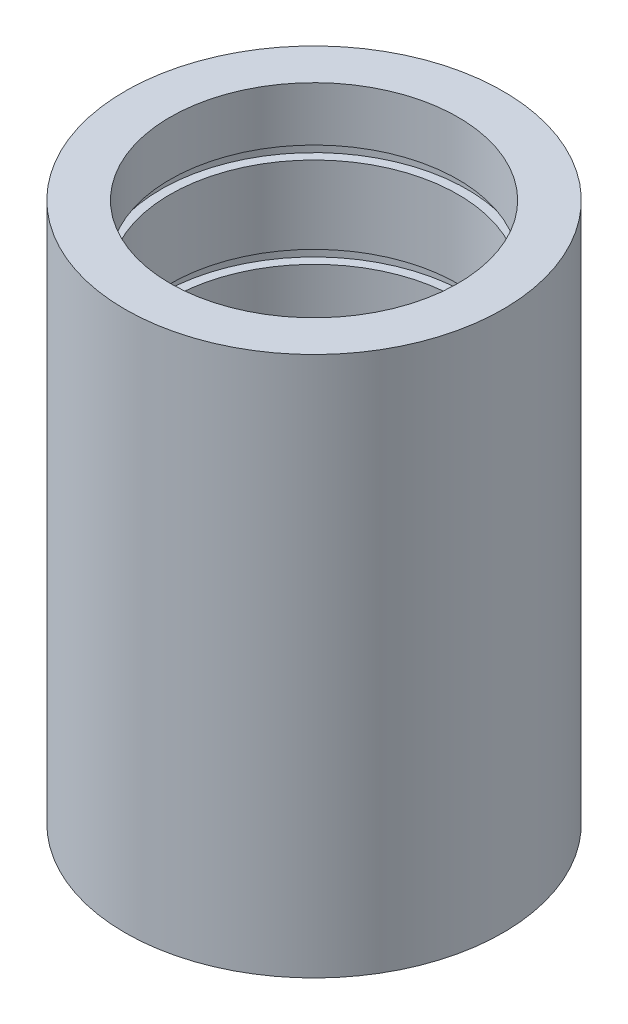
ISO-10303-21;
HEADER;
FILE_DESCRIPTION(('STEP AP214'),'2;1');
FILE_NAME('part.step','',(''),(''),'','','');
FILE_SCHEMA(('AUTOMOTIVE_DESIGN { 1 0 10303 214 1 1 1 1 }'));
ENDSEC;
DATA;
#1=APPLICATION_CONTEXT('core data for automotive mechanical design processes');
#2=APPLICATION_PROTOCOL_DEFINITION('international standard','automotive_design',2000,#1);
#3=PRODUCT_CONTEXT('',#1,'mechanical');
#4=PRODUCT('Part','Part','',(#3));
#5=PRODUCT_RELATED_PRODUCT_CATEGORY('part','',(#4));
#6=PRODUCT_DEFINITION_FORMATION('','',#4);
#7=PRODUCT_DEFINITION_CONTEXT('part definition',#1,'design');
#8=PRODUCT_DEFINITION('design','',#6,#7);
#9=PRODUCT_DEFINITION_SHAPE('','',#8);
#10=(LENGTH_UNIT() NAMED_UNIT(*) SI_UNIT(.MILLI.,.METRE.));
#11=(NAMED_UNIT(*) PLANE_ANGLE_UNIT() SI_UNIT($,.RADIAN.));
#12=(NAMED_UNIT(*) SI_UNIT($,.STERADIAN.) SOLID_ANGLE_UNIT());
#13=UNCERTAINTY_MEASURE_WITH_UNIT(LENGTH_MEASURE(1.E-05),#10,'distance_accuracy_value','');
#14=(GEOMETRIC_REPRESENTATION_CONTEXT(3) GLOBAL_UNCERTAINTY_ASSIGNED_CONTEXT((#13)) GLOBAL_UNIT_ASSIGNED_CONTEXT((#10,
#11,#12)) REPRESENTATION_CONTEXT('',''));
#15=CARTESIAN_POINT('',(0.,0.,0.));
#16=DIRECTION('',(0.,0.,1.));
#17=DIRECTION('',(1.,0.,0.));
#18=AXIS2_PLACEMENT_3D('',#15,#16,#17);
#19=CARTESIAN_POINT('',(0.,150.,0.));
#20=DIRECTION('',(0.,-1.,0.));
#21=DIRECTION('',(0.,0.,-1.));
#22=AXIS2_PLACEMENT_3D('',#19,#20,#21);
#23=CYLINDRICAL_SURFACE('',#22,40.);
#24=CARTESIAN_POINT('',(0.,106.3,0.));
#25=DIRECTION('',(0.,1.,0.));
#26=DIRECTION('',(0.,0.,1.));
#27=AXIS2_PLACEMENT_3D('',#24,#25,#26);
#28=CIRCLE('',#27,40.);
#29=CARTESIAN_POINT('',(0.,106.3,40.));
#30=VERTEX_POINT('',#29);
#31=EDGE_CURVE('E184',#30,#30,#28,.T.);
#32=ORIENTED_EDGE('',*,*,#31,.T.);
#33=EDGE_LOOP('',(#32));
#34=FACE_BOUND('',#33,.T.);
#35=CARTESIAN_POINT('',(0.,53.7,0.));
#36=DIRECTION('',(0.,-1.,0.));
#37=DIRECTION('',(0.,0.,-1.));
#38=AXIS2_PLACEMENT_3D('',#35,#36,#37);
#39=CIRCLE('',#38,40.);
#40=CARTESIAN_POINT('',(0.,53.7,-40.));
#41=VERTEX_POINT('',#40);
#42=EDGE_CURVE('E52',#41,#41,#39,.T.);
#43=ORIENTED_EDGE('',*,*,#42,.T.);
#44=EDGE_LOOP('',(#43));
#45=FACE_BOUND('',#44,.T.);
#46=ADVANCED_FACE('F48',(#34,#45),#23,.F.);
#47=CARTESIAN_POINT('',(0.,50.1,0.));
#48=DIRECTION('',(0.,-1.,0.));
#49=DIRECTION('',(0.,0.,-1.));
#50=AXIS2_PLACEMENT_3D('',#47,#48,#49);
#51=CIRCLE('',#50,40.);
#52=CARTESIAN_POINT('',(0.,50.1,-40.));
#53=VERTEX_POINT('',#52);
#54=EDGE_CURVE('E162',#53,#53,#51,.T.);
#55=ORIENTED_EDGE('',*,*,#54,.F.);
#56=EDGE_LOOP('',(#55));
#57=FACE_BOUND('',#56,.T.);
#58=CARTESIAN_POINT('',(0.,0.,0.));
#59=DIRECTION('',(0.,1.,0.));
#60=DIRECTION('',(0.,0.,1.));
#61=AXIS2_PLACEMENT_3D('',#58,#59,#60);
#62=CIRCLE('',#61,40.);
#63=CARTESIAN_POINT('',(0.,0.,40.));
#64=VERTEX_POINT('',#63);
#65=EDGE_CURVE('E189',#64,#64,#62,.T.);
#66=ORIENTED_EDGE('',*,*,#65,.F.);
#67=EDGE_LOOP('',(#66));
#68=FACE_BOUND('',#67,.T.);
#69=ADVANCED_FACE('F240',(#57,#68),#23,.F.);
#70=CARTESIAN_POINT('',(0.,109.9,0.));
#71=DIRECTION('',(0.,1.,0.));
#72=DIRECTION('',(0.,0.,1.));
#73=AXIS2_PLACEMENT_3D('',#70,#71,#72);
#74=CIRCLE('',#73,40.);
#75=CARTESIAN_POINT('',(0.,109.9,40.));
#76=VERTEX_POINT('',#75);
#77=EDGE_CURVE('E170',#76,#76,#74,.T.);
#78=ORIENTED_EDGE('',*,*,#77,.F.);
#79=EDGE_LOOP('',(#78));
#80=FACE_BOUND('',#79,.T.);
#81=CARTESIAN_POINT('',(0.,131.4,0.));
#82=DIRECTION('',(0.,1.,0.));
#83=DIRECTION('',(0.,0.,1.));
#84=AXIS2_PLACEMENT_3D('',#81,#82,#83);
#85=CIRCLE('',#84,40.);
#86=CARTESIAN_POINT('',(0.,131.4,40.));
#87=VERTEX_POINT('',#86);
#88=EDGE_CURVE('E193',#87,#87,#85,.T.);
#89=ORIENTED_EDGE('',*,*,#88,.T.);
#90=EDGE_LOOP('',(#89));
#91=FACE_BOUND('',#90,.T.);
#92=ADVANCED_FACE('F245',(#80,#91),#23,.F.);
#93=CARTESIAN_POINT('',(0.,135.,0.));
#94=DIRECTION('',(0.,1.,0.));
#95=DIRECTION('',(0.,0.,1.));
#96=AXIS2_PLACEMENT_3D('',#93,#94,#95);
#97=CIRCLE('',#96,40.);
#98=CARTESIAN_POINT('',(0.,135.,40.));
#99=VERTEX_POINT('',#98);
#100=EDGE_CURVE('E179',#99,#99,#97,.T.);
#101=ORIENTED_EDGE('',*,*,#100,.F.);
#102=EDGE_LOOP('',(#101));
#103=FACE_BOUND('',#102,.T.);
#104=CARTESIAN_POINT('',(0.,150.,0.));
#105=DIRECTION('',(0.,1.,0.));
#106=DIRECTION('',(0.,0.,1.));
#107=AXIS2_PLACEMENT_3D('',#104,#105,#106);
#108=CIRCLE('',#107,40.);
#109=CARTESIAN_POINT('',(0.,150.,40.));
#110=VERTEX_POINT('',#109);
#111=EDGE_CURVE('E58',#110,#110,#108,.T.);
#112=ORIENTED_EDGE('',*,*,#111,.T.);
#113=EDGE_LOOP('',(#112));
#114=FACE_BOUND('',#113,.T.);
#115=ADVANCED_FACE('F50',(#103,#114),#23,.F.);
#116=CARTESIAN_POINT('',(0.,150.,0.));
#117=DIRECTION('',(0.,-1.,0.));
#118=DIRECTION('',(0.,0.,-1.));
#119=AXIS2_PLACEMENT_3D('',#116,#117,#118);
#120=CYLINDRICAL_SURFACE('',#119,52.5);
#121=CARTESIAN_POINT('',(0.,150.,0.));
#122=DIRECTION('',(0.,1.,0.));
#123=DIRECTION('',(0.,0.,1.));
#124=AXIS2_PLACEMENT_3D('',#121,#122,#123);
#125=CIRCLE('',#124,52.5);
#126=CARTESIAN_POINT('',(0.,150.,52.5));
#127=VERTEX_POINT('',#126);
#128=EDGE_CURVE('E11',#127,#127,#125,.T.);
#129=ORIENTED_EDGE('',*,*,#128,.F.);
#130=EDGE_LOOP('',(#129));
#131=FACE_BOUND('',#130,.T.);
#132=CARTESIAN_POINT('',(0.,0.,0.));
#133=DIRECTION('',(0.,1.,0.));
#134=DIRECTION('',(0.,0.,1.));
#135=AXIS2_PLACEMENT_3D('',#132,#133,#134);
#136=CIRCLE('',#135,52.5);
#137=CARTESIAN_POINT('',(0.,0.,52.5));
#138=VERTEX_POINT('',#137);
#139=EDGE_CURVE('E187',#138,#138,#136,.T.);
#140=ORIENTED_EDGE('',*,*,#139,.T.);
#141=EDGE_LOOP('',(#140));
#142=FACE_BOUND('',#141,.T.);
#143=ADVANCED_FACE('F248',(#131,#142),#120,.T.);
#144=CARTESIAN_POINT('',(0.,150.,0.));
#145=DIRECTION('',(0.,1.,0.));
#146=DIRECTION('',(0.,0.,1.));
#147=AXIS2_PLACEMENT_3D('',#144,#145,#146);
#148=PLANE('',#147);
#149=ORIENTED_EDGE('',*,*,#111,.F.);
#150=EDGE_LOOP('',(#149));
#151=FACE_BOUND('',#150,.T.);
#152=ORIENTED_EDGE('',*,*,#128,.T.);
#153=EDGE_LOOP('',(#152));
#154=FACE_BOUND('',#153,.T.);
#155=ADVANCED_FACE('F254',(#151,#154),#148,.T.);
#156=CARTESIAN_POINT('',(0.,0.,0.));
#157=DIRECTION('',(0.,1.,0.));
#158=DIRECTION('',(0.,0.,1.));
#159=AXIS2_PLACEMENT_3D('',#156,#157,#158);
#160=PLANE('',#159);
#161=CARTESIAN_POINT('',(0.,0.,46.25));
#162=DIRECTION('',(0.,-1.,0.));
#163=DIRECTION('',(0.,0.,-1.));
#164=AXIS2_PLACEMENT_3D('',#161,#162,#163);
#165=CIRCLE('',#164,4.025);
#166=CARTESIAN_POINT('',(0.,0.,42.225));
#167=VERTEX_POINT('',#166);
#168=EDGE_CURVE('E98',#167,#167,#165,.T.);
#169=ORIENTED_EDGE('',*,*,#168,.F.);
#170=EDGE_LOOP('',(#169));
#171=FACE_BOUND('',#170,.T.);
#172=CARTESIAN_POINT('',(40.0536749250307,0.,23.1249999999994));
#173=DIRECTION('',(0.,-1.,0.));
#174=DIRECTION('',(0.,0.,-1.));
#175=AXIS2_PLACEMENT_3D('',#172,#173,#174);
#176=CIRCLE('',#175,4.025);
#177=CARTESIAN_POINT('',(40.0536749250307,0.,19.0999999999994));
#178=VERTEX_POINT('',#177);
#179=EDGE_CURVE('E89',#178,#178,#176,.T.);
#180=ORIENTED_EDGE('',*,*,#179,.F.);
#181=EDGE_LOOP('',(#180));
#182=FACE_BOUND('',#181,.T.);
#183=CARTESIAN_POINT('',(40.0536749250298,0.,-23.1250000000008));
#184=DIRECTION('',(0.,-1.,0.));
#185=DIRECTION('',(0.,0.,-1.));
#186=AXIS2_PLACEMENT_3D('',#183,#184,#185);
#187=CIRCLE('',#186,4.025);
#188=CARTESIAN_POINT('',(40.0536749250298,0.,-27.1500000000008));
#189=VERTEX_POINT('',#188);
#190=EDGE_CURVE('E109',#189,#189,#187,.T.);
#191=ORIENTED_EDGE('',*,*,#190,.F.);
#192=EDGE_LOOP('',(#191));
#193=FACE_BOUND('',#192,.T.);
#194=CARTESIAN_POINT('',(-3.19189119579733E-13,0.,-46.25));
#195=DIRECTION('',(0.,-1.,0.));
#196=DIRECTION('',(0.,0.,-1.));
#197=AXIS2_PLACEMENT_3D('',#194,#195,#196);
#198=CIRCLE('',#197,4.025);
#199=CARTESIAN_POINT('',(-3.19189119579733E-13,0.,-50.275));
#200=VERTEX_POINT('',#199);
#201=EDGE_CURVE('E121',#200,#200,#198,.T.);
#202=ORIENTED_EDGE('',*,*,#201,.F.);
#203=EDGE_LOOP('',(#202));
#204=FACE_BOUND('',#203,.T.);
#205=CARTESIAN_POINT('',(-40.0536749250305,0.,-23.1249999999996));
#206=DIRECTION('',(0.,-1.,0.));
#207=DIRECTION('',(0.,0.,-1.));
#208=AXIS2_PLACEMENT_3D('',#205,#206,#207);
#209=CIRCLE('',#208,4.025);
#210=CARTESIAN_POINT('',(-40.0536749250305,0.,-27.1499999999996));
#211=VERTEX_POINT('',#210);
#212=EDGE_CURVE('E133',#211,#211,#209,.T.);
#213=ORIENTED_EDGE('',*,*,#212,.F.);
#214=EDGE_LOOP('',(#213));
#215=FACE_BOUND('',#214,.T.);
#216=CARTESIAN_POINT('',(-40.05367492503,0.,23.1250000000005));
#217=DIRECTION('',(0.,-1.,0.));
#218=DIRECTION('',(0.,0.,-1.));
#219=AXIS2_PLACEMENT_3D('',#216,#217,#218);
#220=CIRCLE('',#219,4.025);
#221=CARTESIAN_POINT('',(-40.05367492503,0.,19.1000000000005));
#222=VERTEX_POINT('',#221);
#223=EDGE_CURVE('E145',#222,#222,#220,.T.);
#224=ORIENTED_EDGE('',*,*,#223,.F.);
#225=EDGE_LOOP('',(#224));
#226=FACE_BOUND('',#225,.T.);
#227=ORIENTED_EDGE('',*,*,#65,.T.);
#228=EDGE_LOOP('',(#227));
#229=FACE_BOUND('',#228,.T.);
#230=ORIENTED_EDGE('',*,*,#139,.F.);
#231=EDGE_LOOP('',(#230));
#232=FACE_BOUND('',#231,.T.);
#233=ADVANCED_FACE('F263',(#171,#182,#193,#204,#215,#226,#229,#232),#160,.F.);
#234=CARTESIAN_POINT('',(0.,131.4,0.));
#235=DIRECTION('',(0.,1.,0.));
#236=DIRECTION('',(0.,0.,1.));
#237=AXIS2_PLACEMENT_3D('',#234,#235,#236);
#238=CYLINDRICAL_SURFACE('',#237,42.5);
#239=CARTESIAN_POINT('',(0.,131.4,0.));
#240=DIRECTION('',(0.,1.,0.));
#241=DIRECTION('',(0.,0.,1.));
#242=AXIS2_PLACEMENT_3D('',#239,#240,#241);
#243=CIRCLE('',#242,42.5);
#244=CARTESIAN_POINT('',(0.,131.4,42.5));
#245=VERTEX_POINT('',#244);
#246=EDGE_CURVE('E175',#245,#245,#243,.T.);
#247=ORIENTED_EDGE('',*,*,#246,.F.);
#248=EDGE_LOOP('',(#247));
#249=FACE_BOUND('',#248,.T.);
#250=CARTESIAN_POINT('',(0.,135.,0.));
#251=DIRECTION('',(0.,1.,0.));
#252=DIRECTION('',(0.,0.,1.));
#253=AXIS2_PLACEMENT_3D('',#250,#251,#252);
#254=CIRCLE('',#253,42.5);
#255=CARTESIAN_POINT('',(0.,135.,42.5));
#256=VERTEX_POINT('',#255);
#257=EDGE_CURVE('E180',#256,#256,#254,.T.);
#258=ORIENTED_EDGE('',*,*,#257,.T.);
#259=EDGE_LOOP('',(#258));
#260=FACE_BOUND('',#259,.T.);
#261=ADVANCED_FACE('F270',(#249,#260),#238,.F.);
#262=CARTESIAN_POINT('',(0.,131.4,0.));
#263=DIRECTION('',(0.,1.,0.));
#264=DIRECTION('',(0.,0.,1.));
#265=AXIS2_PLACEMENT_3D('',#262,#263,#264);
#266=PLANE('',#265);
#267=ORIENTED_EDGE('',*,*,#88,.F.);
#268=EDGE_LOOP('',(#267));
#269=FACE_BOUND('',#268,.T.);
#270=ORIENTED_EDGE('',*,*,#246,.T.);
#271=EDGE_LOOP('',(#270));
#272=FACE_BOUND('',#271,.T.);
#273=ADVANCED_FACE('F276',(#269,#272),#266,.T.);
#274=CARTESIAN_POINT('',(0.,135.,0.));
#275=DIRECTION('',(0.,1.,0.));
#276=DIRECTION('',(0.,0.,1.));
#277=AXIS2_PLACEMENT_3D('',#274,#275,#276);
#278=PLANE('',#277);
#279=ORIENTED_EDGE('',*,*,#100,.T.);
#280=EDGE_LOOP('',(#279));
#281=FACE_BOUND('',#280,.T.);
#282=ORIENTED_EDGE('',*,*,#257,.F.);
#283=EDGE_LOOP('',(#282));
#284=FACE_BOUND('',#283,.T.);
#285=ADVANCED_FACE('F282',(#281,#284),#278,.F.);
#286=CARTESIAN_POINT('',(0.,106.3,0.));
#287=DIRECTION('',(0.,1.,0.));
#288=DIRECTION('',(0.,0.,1.));
#289=AXIS2_PLACEMENT_3D('',#286,#287,#288);
#290=CYLINDRICAL_SURFACE('',#289,42.5);
#291=CARTESIAN_POINT('',(0.,106.3,0.));
#292=DIRECTION('',(0.,1.,0.));
#293=DIRECTION('',(0.,0.,1.));
#294=AXIS2_PLACEMENT_3D('',#291,#292,#293);
#295=CIRCLE('',#294,42.5);
#296=CARTESIAN_POINT('',(0.,106.3,42.5));
#297=VERTEX_POINT('',#296);
#298=EDGE_CURVE('E166',#297,#297,#295,.T.);
#299=ORIENTED_EDGE('',*,*,#298,.F.);
#300=EDGE_LOOP('',(#299));
#301=FACE_BOUND('',#300,.T.);
#302=CARTESIAN_POINT('',(0.,109.9,0.));
#303=DIRECTION('',(0.,1.,0.));
#304=DIRECTION('',(0.,0.,1.));
#305=AXIS2_PLACEMENT_3D('',#302,#303,#304);
#306=CIRCLE('',#305,42.5);
#307=CARTESIAN_POINT('',(0.,109.9,42.5));
#308=VERTEX_POINT('',#307);
#309=EDGE_CURVE('E171',#308,#308,#306,.T.);
#310=ORIENTED_EDGE('',*,*,#309,.T.);
#311=EDGE_LOOP('',(#310));
#312=FACE_BOUND('',#311,.T.);
#313=ADVANCED_FACE('F285',(#301,#312),#290,.F.);
#314=CARTESIAN_POINT('',(0.,106.3,0.));
#315=DIRECTION('',(0.,1.,0.));
#316=DIRECTION('',(0.,0.,1.));
#317=AXIS2_PLACEMENT_3D('',#314,#315,#316);
#318=PLANE('',#317);
#319=ORIENTED_EDGE('',*,*,#31,.F.);
#320=EDGE_LOOP('',(#319));
#321=FACE_BOUND('',#320,.T.);
#322=ORIENTED_EDGE('',*,*,#298,.T.);
#323=EDGE_LOOP('',(#322));
#324=FACE_BOUND('',#323,.T.);
#325=ADVANCED_FACE('F292',(#321,#324),#318,.T.);
#326=CARTESIAN_POINT('',(0.,109.9,0.));
#327=DIRECTION('',(0.,1.,0.));
#328=DIRECTION('',(0.,0.,1.));
#329=AXIS2_PLACEMENT_3D('',#326,#327,#328);
#330=PLANE('',#329);
#331=ORIENTED_EDGE('',*,*,#77,.T.);
#332=EDGE_LOOP('',(#331));
#333=FACE_BOUND('',#332,.T.);
#334=ORIENTED_EDGE('',*,*,#309,.F.);
#335=EDGE_LOOP('',(#334));
#336=FACE_BOUND('',#335,.T.);
#337=ADVANCED_FACE('F227',(#333,#336),#330,.F.);
#338=CARTESIAN_POINT('',(0.,53.7,0.));
#339=DIRECTION('',(0.,-1.,0.));
#340=DIRECTION('',(0.,0.,-1.));
#341=AXIS2_PLACEMENT_3D('',#338,#339,#340);
#342=CYLINDRICAL_SURFACE('',#341,42.5);
#343=CARTESIAN_POINT('',(0.,53.7,0.));
#344=DIRECTION('',(0.,-1.,0.));
#345=DIRECTION('',(0.,0.,-1.));
#346=AXIS2_PLACEMENT_3D('',#343,#344,#345);
#347=CIRCLE('',#346,42.5);
#348=CARTESIAN_POINT('',(0.,53.7,-42.5));
#349=VERTEX_POINT('',#348);
#350=EDGE_CURVE('E158',#349,#349,#347,.T.);
#351=ORIENTED_EDGE('',*,*,#350,.F.);
#352=EDGE_LOOP('',(#351));
#353=FACE_BOUND('',#352,.T.);
#354=CARTESIAN_POINT('',(0.,50.1,0.));
#355=DIRECTION('',(0.,-1.,0.));
#356=DIRECTION('',(0.,0.,-1.));
#357=AXIS2_PLACEMENT_3D('',#354,#355,#356);
#358=CIRCLE('',#357,42.5);
#359=CARTESIAN_POINT('',(0.,50.1,-42.5));
#360=VERTEX_POINT('',#359);
#361=EDGE_CURVE('E157',#360,#360,#358,.T.);
#362=ORIENTED_EDGE('',*,*,#361,.T.);
#363=EDGE_LOOP('',(#362));
#364=FACE_BOUND('',#363,.T.);
#365=ADVANCED_FACE('F221',(#353,#364),#342,.F.);
#366=CARTESIAN_POINT('',(0.,53.7,0.));
#367=DIRECTION('',(0.,-1.,0.));
#368=DIRECTION('',(0.,0.,-1.));
#369=AXIS2_PLACEMENT_3D('',#366,#367,#368);
#370=PLANE('',#369);
#371=ORIENTED_EDGE('',*,*,#42,.F.);
#372=EDGE_LOOP('',(#371));
#373=FACE_BOUND('',#372,.T.);
#374=ORIENTED_EDGE('',*,*,#350,.T.);
#375=EDGE_LOOP('',(#374));
#376=FACE_BOUND('',#375,.T.);
#377=ADVANCED_FACE('F217',(#373,#376),#370,.T.);
#378=CARTESIAN_POINT('',(0.,50.1,0.));
#379=DIRECTION('',(0.,-1.,0.));
#380=DIRECTION('',(0.,0.,-1.));
#381=AXIS2_PLACEMENT_3D('',#378,#379,#380);
#382=PLANE('',#381);
#383=ORIENTED_EDGE('',*,*,#54,.T.);
#384=EDGE_LOOP('',(#383));
#385=FACE_BOUND('',#384,.T.);
#386=ORIENTED_EDGE('',*,*,#361,.F.);
#387=EDGE_LOOP('',(#386));
#388=FACE_BOUND('',#387,.T.);
#389=ADVANCED_FACE('F220',(#385,#388),#382,.F.);
#390=CARTESIAN_POINT('',(-40.05367492503,22.5965575238898,23.1250000000005));
#391=DIRECTION('',(0.,-1.,0.));
#392=DIRECTION('',(0.,0.,-1.));
#393=AXIS2_PLACEMENT_3D('',#390,#391,#392);
#394=CONICAL_SURFACE('',#393,4.,1.02974425867665);
#395=CARTESIAN_POINT('',(-40.05367492503,25.,23.1250000000005));
#396=VERTEX_POINT('',#395);
#397=VERTEX_LOOP('',#396);
#398=FACE_BOUND('',#397,.T.);
#399=CARTESIAN_POINT('',(-40.05367492503,22.5965575238898,23.1250000000005));
#400=DIRECTION('',(0.,-1.,0.));
#401=DIRECTION('',(0.,0.,-1.));
#402=AXIS2_PLACEMENT_3D('',#399,#400,#401);
#403=CIRCLE('',#402,4.);
#404=CARTESIAN_POINT('',(-40.05367492503,22.5965575238898,19.1250000000005));
#405=VERTEX_POINT('',#404);
#406=EDGE_CURVE('E153',#405,#405,#403,.T.);
#407=ORIENTED_EDGE('',*,*,#406,.T.);
#408=EDGE_LOOP('',(#407));
#409=FACE_BOUND('',#408,.T.);
#410=ADVANCED_FACE('F232',(#398,#409),#394,.F.);
#411=CARTESIAN_POINT('',(-40.05367492503,0.,23.1250000000005));
#412=DIRECTION('',(0.,-1.,0.));
#413=DIRECTION('',(0.,0.,-1.));
#414=AXIS2_PLACEMENT_3D('',#411,#412,#413);
#415=CYLINDRICAL_SURFACE('',#414,4.);
#416=ORIENTED_EDGE('',*,*,#406,.F.);
#417=EDGE_LOOP('',(#416));
#418=FACE_BOUND('',#417,.T.);
#419=CARTESIAN_POINT('',(-40.05367492503,0.0250000000000007,23.1250000000005));
#420=DIRECTION('',(0.,-1.,0.));
#421=DIRECTION('',(0.,0.,-1.));
#422=AXIS2_PLACEMENT_3D('',#419,#420,#421);
#423=CIRCLE('',#422,4.);
#424=CARTESIAN_POINT('',(-40.05367492503,0.0250000000000007,19.1250000000005));
#425=VERTEX_POINT('',#424);
#426=EDGE_CURVE('E149',#425,#425,#423,.T.);
#427=ORIENTED_EDGE('',*,*,#426,.T.);
#428=EDGE_LOOP('',(#427));
#429=FACE_BOUND('',#428,.T.);
#430=ADVANCED_FACE('F237',(#418,#429),#415,.F.);
#431=CARTESIAN_POINT('',(-40.05367492503,0.,23.1250000000005));
#432=DIRECTION('',(0.,-1.,0.));
#433=DIRECTION('',(0.,0.,-1.));
#434=AXIS2_PLACEMENT_3D('',#431,#432,#433);
#435=CONICAL_SURFACE('',#434,4.025,0.785398163397518);
#436=ORIENTED_EDGE('',*,*,#426,.F.);
#437=EDGE_LOOP('',(#436));
#438=FACE_BOUND('',#437,.T.);
#439=ORIENTED_EDGE('',*,*,#223,.T.);
#440=EDGE_LOOP('',(#439));
#441=FACE_BOUND('',#440,.T.);
#442=ADVANCED_FACE('F351',(#438,#441),#435,.F.);
#443=CARTESIAN_POINT('',(-40.0536749250305,22.5965575238898,-23.1249999999996));
#444=DIRECTION('',(0.,-1.,0.));
#445=DIRECTION('',(0.,0.,-1.));
#446=AXIS2_PLACEMENT_3D('',#443,#444,#445);
#447=CONICAL_SURFACE('',#446,4.,1.02974425867665);
#448=CARTESIAN_POINT('',(-40.0536749250305,25.,-23.1249999999996));
#449=VERTEX_POINT('',#448);
#450=VERTEX_LOOP('',#449);
#451=FACE_BOUND('',#450,.T.);
#452=CARTESIAN_POINT('',(-40.0536749250305,22.5965575238898,-23.1249999999996));
#453=DIRECTION('',(0.,-1.,0.));
#454=DIRECTION('',(0.,0.,-1.));
#455=AXIS2_PLACEMENT_3D('',#452,#453,#454);
#456=CIRCLE('',#455,4.);
#457=CARTESIAN_POINT('',(-40.0536749250305,22.5965575238898,-27.1249999999996));
#458=VERTEX_POINT('',#457);
#459=EDGE_CURVE('E141',#458,#458,#456,.T.);
#460=ORIENTED_EDGE('',*,*,#459,.T.);
#461=EDGE_LOOP('',(#460));
#462=FACE_BOUND('',#461,.T.);
#463=ADVANCED_FACE('F362',(#451,#462),#447,.F.);
#464=CARTESIAN_POINT('',(-40.0536749250305,0.,-23.1249999999996));
#465=DIRECTION('',(0.,-1.,0.));
#466=DIRECTION('',(0.,0.,-1.));
#467=AXIS2_PLACEMENT_3D('',#464,#465,#466);
#468=CYLINDRICAL_SURFACE('',#467,4.);
#469=ORIENTED_EDGE('',*,*,#459,.F.);
#470=EDGE_LOOP('',(#469));
#471=FACE_BOUND('',#470,.T.);
#472=CARTESIAN_POINT('',(-40.0536749250305,0.0250000000000007,-23.1249999999996));
#473=DIRECTION('',(0.,-1.,0.));
#474=DIRECTION('',(0.,0.,-1.));
#475=AXIS2_PLACEMENT_3D('',#472,#473,#474);
#476=CIRCLE('',#475,4.);
#477=CARTESIAN_POINT('',(-40.0536749250305,0.0250000000000007,-27.1249999999996));
#478=VERTEX_POINT('',#477);
#479=EDGE_CURVE('E137',#478,#478,#476,.T.);
#480=ORIENTED_EDGE('',*,*,#479,.T.);
#481=EDGE_LOOP('',(#480));
#482=FACE_BOUND('',#481,.T.);
#483=ADVANCED_FACE('F373',(#471,#482),#468,.F.);
#484=CARTESIAN_POINT('',(-40.0536749250305,0.,-23.1249999999996));
#485=DIRECTION('',(0.,-1.,0.));
#486=DIRECTION('',(0.,0.,-1.));
#487=AXIS2_PLACEMENT_3D('',#484,#485,#486);
#488=CONICAL_SURFACE('',#487,4.025,0.785398163397518);
#489=ORIENTED_EDGE('',*,*,#479,.F.);
#490=EDGE_LOOP('',(#489));
#491=FACE_BOUND('',#490,.T.);
#492=ORIENTED_EDGE('',*,*,#212,.T.);
#493=EDGE_LOOP('',(#492));
#494=FACE_BOUND('',#493,.T.);
#495=ADVANCED_FACE('F384',(#491,#494),#488,.F.);
#496=CARTESIAN_POINT('',(-3.19189119579733E-13,22.5965575238898,-46.25));
#497=DIRECTION('',(0.,-1.,0.));
#498=DIRECTION('',(0.,0.,-1.));
#499=AXIS2_PLACEMENT_3D('',#496,#497,#498);
#500=CONICAL_SURFACE('',#499,4.,1.02974425867665);
#501=CARTESIAN_POINT('',(-3.25260651745651E-13,25.,-46.25));
#502=VERTEX_POINT('',#501);
#503=VERTEX_LOOP('',#502);
#504=FACE_BOUND('',#503,.T.);
#505=CARTESIAN_POINT('',(-3.19189119579733E-13,22.5965575238898,-46.25));
#506=DIRECTION('',(0.,-1.,0.));
#507=DIRECTION('',(0.,0.,-1.));
#508=AXIS2_PLACEMENT_3D('',#505,#506,#507);
#509=CIRCLE('',#508,4.);
#510=CARTESIAN_POINT('',(-3.19189119579733E-13,22.5965575238898,-50.25));
#511=VERTEX_POINT('',#510);
#512=EDGE_CURVE('E129',#511,#511,#509,.T.);
#513=ORIENTED_EDGE('',*,*,#512,.T.);
#514=EDGE_LOOP('',(#513));
#515=FACE_BOUND('',#514,.T.);
#516=ADVANCED_FACE('F396',(#504,#515),#500,.F.);
#517=CARTESIAN_POINT('',(-3.19189119579733E-13,0.,-46.25));
#518=DIRECTION('',(0.,-1.,0.));
#519=DIRECTION('',(0.,0.,-1.));
#520=AXIS2_PLACEMENT_3D('',#517,#518,#519);
#521=CYLINDRICAL_SURFACE('',#520,4.);
#522=ORIENTED_EDGE('',*,*,#512,.F.);
#523=EDGE_LOOP('',(#522));
#524=FACE_BOUND('',#523,.T.);
#525=CARTESIAN_POINT('',(-3.19189119579733E-13,0.0250000000000007,-46.25));
#526=DIRECTION('',(0.,-1.,0.));
#527=DIRECTION('',(0.,0.,-1.));
#528=AXIS2_PLACEMENT_3D('',#525,#526,#527);
#529=CIRCLE('',#528,4.);
#530=CARTESIAN_POINT('',(-3.19189119579733E-13,0.0250000000000007,-50.25));
#531=VERTEX_POINT('',#530);
#532=EDGE_CURVE('E125',#531,#531,#529,.T.);
#533=ORIENTED_EDGE('',*,*,#532,.T.);
#534=EDGE_LOOP('',(#533));
#535=FACE_BOUND('',#534,.T.);
#536=ADVANCED_FACE('F407',(#524,#535),#521,.F.);
#537=CARTESIAN_POINT('',(-3.19189119579733E-13,0.,-46.25));
#538=DIRECTION('',(0.,-1.,0.));
#539=DIRECTION('',(0.,0.,-1.));
#540=AXIS2_PLACEMENT_3D('',#537,#538,#539);
#541=CONICAL_SURFACE('',#540,4.025,0.785398163397483);
#542=ORIENTED_EDGE('',*,*,#532,.F.);
#543=EDGE_LOOP('',(#542));
#544=FACE_BOUND('',#543,.T.);
#545=ORIENTED_EDGE('',*,*,#201,.T.);
#546=EDGE_LOOP('',(#545));
#547=FACE_BOUND('',#546,.T.);
#548=ADVANCED_FACE('F418',(#544,#547),#541,.F.);
#549=CARTESIAN_POINT('',(40.0536749250298,22.5965575238898,-23.1250000000008));
#550=DIRECTION('',(0.,-1.,0.));
#551=DIRECTION('',(0.,0.,-1.));
#552=AXIS2_PLACEMENT_3D('',#549,#550,#551);
#553=CONICAL_SURFACE('',#552,4.,1.02974425867665);
#554=CARTESIAN_POINT('',(40.0536749250298,25.,-23.1250000000008));
#555=VERTEX_POINT('',#554);
#556=VERTEX_LOOP('',#555);
#557=FACE_BOUND('',#556,.T.);
#558=CARTESIAN_POINT('',(40.0536749250298,22.5965575238898,-23.1250000000008));
#559=DIRECTION('',(0.,-1.,0.));
#560=DIRECTION('',(0.,0.,-1.));
#561=AXIS2_PLACEMENT_3D('',#558,#559,#560);
#562=CIRCLE('',#561,4.);
#563=CARTESIAN_POINT('',(40.0536749250298,22.5965575238898,-27.1250000000008));
#564=VERTEX_POINT('',#563);
#565=EDGE_CURVE('E117',#564,#564,#562,.T.);
#566=ORIENTED_EDGE('',*,*,#565,.T.);
#567=EDGE_LOOP('',(#566));
#568=FACE_BOUND('',#567,.T.);
#569=ADVANCED_FACE('F430',(#557,#568),#553,.F.);
#570=CARTESIAN_POINT('',(40.0536749250298,0.,-23.1250000000008));
#571=DIRECTION('',(0.,-1.,0.));
#572=DIRECTION('',(0.,0.,-1.));
#573=AXIS2_PLACEMENT_3D('',#570,#571,#572);
#574=CYLINDRICAL_SURFACE('',#573,4.);
#575=ORIENTED_EDGE('',*,*,#565,.F.);
#576=EDGE_LOOP('',(#575));
#577=FACE_BOUND('',#576,.T.);
#578=CARTESIAN_POINT('',(40.0536749250298,0.0250000000000007,-23.1250000000008));
#579=DIRECTION('',(0.,-1.,0.));
#580=DIRECTION('',(0.,0.,-1.));
#581=AXIS2_PLACEMENT_3D('',#578,#579,#580);
#582=CIRCLE('',#581,4.);
#583=CARTESIAN_POINT('',(40.0536749250298,0.0250000000000007,-27.1250000000008));
#584=VERTEX_POINT('',#583);
#585=EDGE_CURVE('E113',#584,#584,#582,.T.);
#586=ORIENTED_EDGE('',*,*,#585,.T.);
#587=EDGE_LOOP('',(#586));
#588=FACE_BOUND('',#587,.T.);
#589=ADVANCED_FACE('F441',(#577,#588),#574,.F.);
#590=CARTESIAN_POINT('',(40.0536749250298,0.,-23.1250000000008));
#591=DIRECTION('',(0.,-1.,0.));
#592=DIRECTION('',(0.,0.,-1.));
#593=AXIS2_PLACEMENT_3D('',#590,#591,#592);
#594=CONICAL_SURFACE('',#593,4.025,0.785398163397518);
#595=ORIENTED_EDGE('',*,*,#585,.F.);
#596=EDGE_LOOP('',(#595));
#597=FACE_BOUND('',#596,.T.);
#598=ORIENTED_EDGE('',*,*,#190,.T.);
#599=EDGE_LOOP('',(#598));
#600=FACE_BOUND('',#599,.T.);
#601=ADVANCED_FACE('F452',(#597,#600),#594,.F.);
#602=CARTESIAN_POINT('',(40.0536749250307,22.5965575238898,23.1249999999994));
#603=DIRECTION('',(0.,-1.,0.));
#604=DIRECTION('',(0.,0.,-1.));
#605=AXIS2_PLACEMENT_3D('',#602,#603,#604);
#606=CONICAL_SURFACE('',#605,4.,1.02974425867665);
#607=CARTESIAN_POINT('',(40.0536749250307,25.,23.1249999999994));
#608=VERTEX_POINT('',#607);
#609=VERTEX_LOOP('',#608);
#610=FACE_BOUND('',#609,.T.);
#611=CARTESIAN_POINT('',(40.0536749250307,22.5965575238898,23.1249999999994));
#612=DIRECTION('',(0.,-1.,0.));
#613=DIRECTION('',(0.,0.,-1.));
#614=AXIS2_PLACEMENT_3D('',#611,#612,#613);
#615=CIRCLE('',#614,4.);
#616=CARTESIAN_POINT('',(40.0536749250307,22.5965575238898,19.1249999999994));
#617=VERTEX_POINT('',#616);
#618=EDGE_CURVE('E105',#617,#617,#615,.T.);
#619=ORIENTED_EDGE('',*,*,#618,.T.);
#620=EDGE_LOOP('',(#619));
#621=FACE_BOUND('',#620,.T.);
#622=ADVANCED_FACE('F464',(#610,#621),#606,.F.);
#623=CARTESIAN_POINT('',(40.0536749250307,0.,23.1249999999994));
#624=DIRECTION('',(0.,-1.,0.));
#625=DIRECTION('',(0.,0.,-1.));
#626=AXIS2_PLACEMENT_3D('',#623,#624,#625);
#627=CYLINDRICAL_SURFACE('',#626,4.);
#628=ORIENTED_EDGE('',*,*,#618,.F.);
#629=EDGE_LOOP('',(#628));
#630=FACE_BOUND('',#629,.T.);
#631=CARTESIAN_POINT('',(40.0536749250307,0.0250000000000007,23.1249999999994));
#632=DIRECTION('',(0.,-1.,0.));
#633=DIRECTION('',(0.,0.,-1.));
#634=AXIS2_PLACEMENT_3D('',#631,#632,#633);
#635=CIRCLE('',#634,4.);
#636=CARTESIAN_POINT('',(40.0536749250307,0.0250000000000007,19.1249999999994));
#637=VERTEX_POINT('',#636);
#638=EDGE_CURVE('E95',#637,#637,#635,.T.);
#639=ORIENTED_EDGE('',*,*,#638,.T.);
#640=EDGE_LOOP('',(#639));
#641=FACE_BOUND('',#640,.T.);
#642=ADVANCED_FACE('F475',(#630,#641),#627,.F.);
#643=CARTESIAN_POINT('',(40.0536749250307,0.,23.1249999999994));
#644=DIRECTION('',(0.,-1.,0.));
#645=DIRECTION('',(0.,0.,-1.));
#646=AXIS2_PLACEMENT_3D('',#643,#644,#645);
#647=CONICAL_SURFACE('',#646,4.025,0.785398163397518);
#648=ORIENTED_EDGE('',*,*,#638,.F.);
#649=EDGE_LOOP('',(#648));
#650=FACE_BOUND('',#649,.T.);
#651=ORIENTED_EDGE('',*,*,#179,.T.);
#652=EDGE_LOOP('',(#651));
#653=FACE_BOUND('',#652,.T.);
#654=ADVANCED_FACE('F82',(#650,#653),#647,.F.);
#655=CARTESIAN_POINT('',(0.,22.5965575238898,46.25));
#656=DIRECTION('',(0.,-1.,0.));
#657=DIRECTION('',(0.,0.,-1.));
#658=AXIS2_PLACEMENT_3D('',#655,#656,#657);
#659=CONICAL_SURFACE('',#658,4.,1.02974425867665);
#660=CARTESIAN_POINT('',(0.,25.,46.25));
#661=VERTEX_POINT('',#660);
#662=VERTEX_LOOP('',#661);
#663=FACE_BOUND('',#662,.T.);
#664=CARTESIAN_POINT('',(0.,22.5965575238898,46.25));
#665=DIRECTION('',(0.,-1.,0.));
#666=DIRECTION('',(0.,0.,-1.));
#667=AXIS2_PLACEMENT_3D('',#664,#665,#666);
#668=CIRCLE('',#667,4.);
#669=CARTESIAN_POINT('',(0.,22.5965575238898,42.25));
#670=VERTEX_POINT('',#669);
#671=EDGE_CURVE('E86',#670,#670,#668,.T.);
#672=ORIENTED_EDGE('',*,*,#671,.T.);
#673=EDGE_LOOP('',(#672));
#674=FACE_BOUND('',#673,.T.);
#675=ADVANCED_FACE('F78',(#663,#674),#659,.F.);
#676=CARTESIAN_POINT('',(0.,0.,46.25));
#677=DIRECTION('',(0.,-1.,0.));
#678=DIRECTION('',(0.,0.,-1.));
#679=AXIS2_PLACEMENT_3D('',#676,#677,#678);
#680=CYLINDRICAL_SURFACE('',#679,4.);
#681=ORIENTED_EDGE('',*,*,#671,.F.);
#682=EDGE_LOOP('',(#681));
#683=FACE_BOUND('',#682,.T.);
#684=CARTESIAN_POINT('',(0.,0.0250000000000007,46.25));
#685=DIRECTION('',(0.,-1.,0.));
#686=DIRECTION('',(0.,0.,-1.));
#687=AXIS2_PLACEMENT_3D('',#684,#685,#686);
#688=CIRCLE('',#687,4.);
#689=CARTESIAN_POINT('',(0.,0.0250000000000007,42.25));
#690=VERTEX_POINT('',#689);
#691=EDGE_CURVE('E90',#690,#690,#688,.T.);
#692=ORIENTED_EDGE('',*,*,#691,.T.);
#693=EDGE_LOOP('',(#692));
#694=FACE_BOUND('',#693,.T.);
#695=ADVANCED_FACE('F81',(#683,#694),#680,.F.);
#696=CARTESIAN_POINT('',(0.,0.,46.25));
#697=DIRECTION('',(0.,-1.,0.));
#698=DIRECTION('',(0.,0.,-1.));
#699=AXIS2_PLACEMENT_3D('',#696,#697,#698);
#700=CONICAL_SURFACE('',#699,4.025,0.785398163397483);
#701=ORIENTED_EDGE('',*,*,#691,.F.);
#702=EDGE_LOOP('',(#701));
#703=FACE_BOUND('',#702,.T.);
#704=ORIENTED_EDGE('',*,*,#168,.T.);
#705=EDGE_LOOP('',(#704));
#706=FACE_BOUND('',#705,.T.);
#707=ADVANCED_FACE('F514',(#703,#706),#700,.F.);
#708=CLOSED_SHELL('',(#46,#69,#92,#115,#143,#155,#233,#261,#273,#285,#313,#325,#337,#365,#377,
#389,#410,#430,#442,#463,#483,#495,#516,#536,#548,#569,#589,#601,#622,#642,#654,#675,#695,#707));
#709=MANIFOLD_SOLID_BREP('B2',#708);
#710=ADVANCED_BREP_SHAPE_REPRESENTATION('',(#18,#709),#14);
#711=SHAPE_DEFINITION_REPRESENTATION(#9,#710);
ENDSEC;
END-ISO-10303-21;
